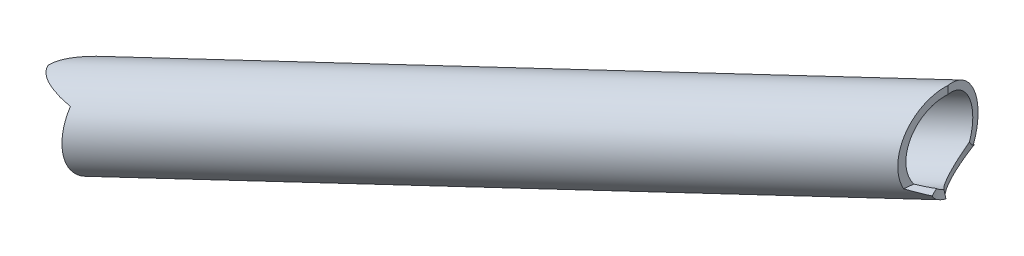
ISO-10303-21;
HEADER;
FILE_DESCRIPTION(('STEP AP214'),'2;1');
FILE_NAME('part.step','',(''),(''),'','','');
FILE_SCHEMA(('AUTOMOTIVE_DESIGN { 1 0 10303 214 1 1 1 1 }'));
ENDSEC;
DATA;
#1=APPLICATION_CONTEXT('core data for automotive mechanical design processes');
#2=APPLICATION_PROTOCOL_DEFINITION('international standard','automotive_design',2000,#1);
#3=PRODUCT_CONTEXT('',#1,'mechanical');
#4=PRODUCT('Part','Part','',(#3));
#5=PRODUCT_RELATED_PRODUCT_CATEGORY('part','',(#4));
#6=PRODUCT_DEFINITION_FORMATION('','',#4);
#7=PRODUCT_DEFINITION_CONTEXT('part definition',#1,'design');
#8=PRODUCT_DEFINITION('design','',#6,#7);
#9=PRODUCT_DEFINITION_SHAPE('','',#8);
#10=(LENGTH_UNIT() NAMED_UNIT(*) SI_UNIT(.MILLI.,.METRE.));
#11=(NAMED_UNIT(*) PLANE_ANGLE_UNIT() SI_UNIT($,.RADIAN.));
#12=(NAMED_UNIT(*) SI_UNIT($,.STERADIAN.) SOLID_ANGLE_UNIT());
#13=UNCERTAINTY_MEASURE_WITH_UNIT(LENGTH_MEASURE(1.E-05),#10,'distance_accuracy_value','');
#14=(GEOMETRIC_REPRESENTATION_CONTEXT(3) GLOBAL_UNCERTAINTY_ASSIGNED_CONTEXT((#13)) GLOBAL_UNIT_ASSIGNED_CONTEXT((#10,
#11,#12)) REPRESENTATION_CONTEXT('',''));
#15=CARTESIAN_POINT('',(0.,0.,0.));
#16=DIRECTION('',(0.,0.,1.));
#17=DIRECTION('',(1.,0.,0.));
#18=AXIS2_PLACEMENT_3D('',#15,#16,#17);
#19=CARTESIAN_POINT('',(325.,320.,-1580.));
#20=DIRECTION('',(-0.214351342090107,-0.914565726251124,-0.342962147344171));
#21=DIRECTION('',(0.,0.351123441588391,-0.936329177569045));
#22=AXIS2_PLACEMENT_3D('',#19,#20,#21);
#23=CYLINDRICAL_SURFACE('',#22,9.49999999999999);
#24=CARTESIAN_POINT('',(247.65625,-10.,-1703.75));
#25=DIRECTION('',(0.,1.,0.));
#26=DIRECTION('',(-0.52999894000318,0.,-0.847998304005088));
#27=AXIS2_PLACEMENT_3D('',#24,#25,#26);
#28=ELLIPSE('',#27,10.3874437094218,9.49999999999999);
#29=CARTESIAN_POINT('',(238.168722071905,-10.,-1706.90270720181));
#30=VERTEX_POINT('',#29);
#31=CARTESIAN_POINT('',(238.075805823074,-10.,-1706.46572045153));
#32=VERTEX_POINT('',#31);
#33=EDGE_CURVE('E221',#30,#32,#28,.T.);
#34=ORIENTED_EDGE('',*,*,#33,.T.);
#35=CARTESIAN_POINT('',(232.820393226593,-73.2996555665351,-1727.48737083745));
#36=DIRECTION('',(0.970142500145332,0.,-0.242535625036333));
#37=DIRECTION('',(-0.0940407512885346,-0.921768805422756,-0.376163005154139));
#38=AXIS2_PLACEMENT_3D('',#35,#36,#37);
#39=ELLIPSE('',#38,76.1396046117398,9.49999999999999);
#40=CARTESIAN_POINT('',(238.275469808564,-8.87542708308277,-1705.66706450957));
#41=VERTEX_POINT('',#40);
#42=EDGE_CURVE('E226',#32,#41,#39,.T.);
#43=ORIENTED_EDGE('',*,*,#42,.T.);
#44=CARTESIAN_POINT('',(239.782773736137,-12.8737095959373,-1698.60180246691));
#45=CARTESIAN_POINT('',(239.692006260419,-12.9119222917252,-1698.71566265582));
#46=CARTESIAN_POINT('',(239.602223253644,-12.9466216887689,-1698.83146667268));
#47=CARTESIAN_POINT('',(239.425209102269,-13.0081878544801,-1699.06699258332));
#48=CARTESIAN_POINT('',(239.337977700843,-13.0350554138938,-1699.18671408023));
#49=CARTESIAN_POINT('',(239.08093837754,-13.1026174647842,-1699.55197306294));
#50=CARTESIAN_POINT('',(238.915776519299,-13.1302751585701,-1699.80361594418));
#51=CARTESIAN_POINT('',(238.682099660331,-13.1398375519976,-1700.19240875895));
#52=CARTESIAN_POINT('',(238.60609363538,-13.137580055441,-1700.32481501614));
#53=CARTESIAN_POINT('',(238.460323287579,-13.1211715105605,-1700.59226680834));
#54=CARTESIAN_POINT('',(238.390555094563,-13.1070278942486,-1700.72731064264));
#55=CARTESIAN_POINT('',(238.258485514363,-13.0660797686918,-1700.99890931638));
#56=CARTESIAN_POINT('',(238.196173946375,-13.0392927749634,-1701.135461811));
#57=CARTESIAN_POINT('',(238.080031637345,-12.9725743749361,-1701.40897057867));
#58=CARTESIAN_POINT('',(238.02619930705,-12.93264543616,-1701.54592677113));
#59=CARTESIAN_POINT('',(237.933542688199,-12.844883986858,-1701.8032309462));
#60=CARTESIAN_POINT('',(237.89370827948,-12.7984640579542,-1701.92369867336));
#61=CARTESIAN_POINT('',(237.821906754938,-12.6955557383986,-1702.16265618788));
#62=CARTESIAN_POINT('',(237.789939045047,-12.6390681085843,-1702.28114612396));
#63=CARTESIAN_POINT('',(237.734095152224,-12.5165887774897,-1702.51511920128));
#64=CARTESIAN_POINT('',(237.71022103014,-12.450594661685,-1702.6306015698));
#65=CARTESIAN_POINT('',(237.670548242228,-12.3099678371142,-1702.85757880647));
#66=CARTESIAN_POINT('',(237.654749555807,-12.2353351503768,-1702.9690736848));
#67=CARTESIAN_POINT('',(237.621618092021,-12.0163070618853,-1703.27365117592));
#68=CARTESIAN_POINT('',(237.612926376163,-11.8633630581482,-1703.4616322651));
#69=CARTESIAN_POINT('',(237.618004985019,-11.5388112968538,-1703.81993854514));
#70=CARTESIAN_POINT('',(237.631782011028,-11.367197985431,-1703.99025845244));
#71=CARTESIAN_POINT('',(237.693541514667,-10.8937931199929,-1704.41843468173));
#72=CARTESIAN_POINT('',(237.757977807344,-10.580128088423,-1704.66089032158));
#73=CARTESIAN_POINT('',(237.882598976666,-10.0945787694214,-1704.9905553039));
#74=CARTESIAN_POINT('',(237.928903649803,-9.92992612682615,-1705.09492292919));
#75=CARTESIAN_POINT('',(238.029443499436,-9.59673517120306,-1705.29313719928));
#76=CARTESIAN_POINT('',(238.083677025867,-9.42819767278117,-1705.38698602599));
#77=CARTESIAN_POINT('',(238.23920489998,-8.96894622023937,-1705.62734758761));
#78=CARTESIAN_POINT('',(238.346809750414,-8.67551914735631,-1705.76458213841));
#79=CARTESIAN_POINT('',(238.576316905579,-8.08359432770293,-1706.01403159344));
#80=CARTESIAN_POINT('',(238.698230217718,-7.78509283017319,-1706.12622704016));
#81=CARTESIAN_POINT('',(238.953073817899,-7.18366679382568,-1706.32851937879));
#82=CARTESIAN_POINT('',(239.086051124451,-6.88072841160394,-1706.41851476285));
#83=CARTESIAN_POINT('',(239.359356137925,-6.27286550034176,-1706.57758422801));
#84=CARTESIAN_POINT('',(239.499681250519,-5.96794170515685,-1706.64666563566));
#85=CARTESIAN_POINT('',(239.738298454073,-5.4564395983941,-1706.74569845231));
#86=CARTESIAN_POINT('',(239.835334866963,-5.25029867522171,-1706.7810590934));
#87=CARTESIAN_POINT('',(240.030681699238,-4.83727550346377,-1706.84296973045));
#88=CARTESIAN_POINT('',(240.128992201631,-4.63039320721947,-1706.86951914932));
#89=CARTESIAN_POINT('',(240.326134963891,-4.21562136062818,-1706.91382084238));
#90=CARTESIAN_POINT('',(240.424967718676,-4.00773088098818,-1706.93156219595));
#91=CARTESIAN_POINT('',(240.622077257612,-3.59111949218371,-1706.95799731861));
#92=CARTESIAN_POINT('',(240.720354069815,-3.38239862584037,-1706.96669154832));
#93=CARTESIAN_POINT('',(240.914702087663,-2.96518032848685,-1706.97458639541));
#94=CARTESIAN_POINT('',(241.010782627164,-2.75668831635517,-1706.97384045504));
#95=CARTESIAN_POINT('',(241.20001643508,-2.3385898609877,-1706.96229158466));
#96=CARTESIAN_POINT('',(241.293169178516,-2.1289832256801,-1706.95148686155));
#97=CARTESIAN_POINT('',(241.474703593222,-1.70905091178722,-1706.91881531044));
#98=CARTESIAN_POINT('',(241.563094609628,-1.49872757228237,-1706.89697109364));
#99=CARTESIAN_POINT('',(241.733197598472,-1.07710307709451,-1706.84078849465));
#100=CARTESIAN_POINT('',(241.814913081132,-0.865802497851082,-1706.8064567313));
#101=CARTESIAN_POINT('',(241.946474201928,-0.504563580365376,-1706.73551066981));
#102=CARTESIAN_POINT('',(241.998647452456,-0.354766771140902,-1706.70250558407));
#103=CARTESIAN_POINT('',(242.097206992492,-0.0552247583612694,-1706.62841628796));
#104=CARTESIAN_POINT('',(242.143593102021,0.0945204434445587,-1706.58733182643));
#105=CARTESIAN_POINT('',(242.22921315779,0.392973033148623,-1706.49627378321));
#106=CARTESIAN_POINT('',(242.268463704466,0.541682035295554,-1706.44632138206));
#107=CARTESIAN_POINT('',(242.33863905596,0.837436727405299,-1706.33655191564));
#108=CARTESIAN_POINT('',(242.369565510991,0.984482741502426,-1706.27673680941));
#109=CARTESIAN_POINT('',(242.418033491382,1.25390089051002,-1706.15617731308));
#110=CARTESIAN_POINT('',(242.436881593928,1.37669025699559,-1706.0968940529));
#111=CARTESIAN_POINT('',(242.467186558548,1.61902522221298,-1705.97036182222));
#112=CARTESIAN_POINT('',(242.478645059312,1.73857153447599,-1705.90311462169));
#113=CARTESIAN_POINT('',(242.493969063744,1.97327707428727,-1705.76063196071));
#114=CARTESIAN_POINT('',(242.497836648068,2.0884374955121,-1705.68539869518));
#115=CARTESIAN_POINT('',(242.498171616062,2.31331195477555,-1705.52716836981));
#116=CARTESIAN_POINT('',(242.494638755539,2.42302581297066,-1705.44417105387));
#117=CARTESIAN_POINT('',(242.48076431483,2.63583554303248,-1705.27109449877));
#118=CARTESIAN_POINT('',(242.470438137981,2.73894580900772,-1705.18103168602));
#119=CARTESIAN_POINT('',(242.443872502729,2.93816128894712,-1704.9942973023));
#120=CARTESIAN_POINT('',(242.427632994945,3.03426644440424,-1704.89762567614));
#121=CARTESIAN_POINT('',(242.39027663956,3.21923212966204,-1704.69822204218));
#122=CARTESIAN_POINT('',(242.369152679131,3.30808183611597,-1704.59548136056));
#123=CARTESIAN_POINT('',(242.323163521343,3.47826478532818,-1704.38473007022));
#124=CARTESIAN_POINT('',(242.29829726785,3.55959589572854,-1704.27671797966));
#125=CARTESIAN_POINT('',(242.234364975778,3.7490199580815,-1704.0073383513));
#126=CARTESIAN_POINT('',(242.193875750635,3.85308064045996,-1703.84346310187));
#127=CARTESIAN_POINT('',(242.110385770336,4.04611107740568,-1703.50765098932));
#128=CARTESIAN_POINT('',(242.067383988415,4.13507460365672,-1703.3357108362));
#129=CARTESIAN_POINT('',(241.981323618566,4.2986023998736,-1702.98491003927));
#130=CARTESIAN_POINT('',(241.938265020182,4.37315072363439,-1702.80604199125));
#131=CARTESIAN_POINT('',(241.854192663671,4.50832720696617,-1702.44265131765));
#132=CARTESIAN_POINT('',(241.813179134929,4.56895380773782,-1702.25812806148));
#133=CARTESIAN_POINT('',(241.733861240021,4.67819595845542,-1701.87950569308));
#134=CARTESIAN_POINT('',(241.695656659189,4.72645316544172,-1701.68528237337));
#135=CARTESIAN_POINT('',(241.624698815335,4.80923265695602,-1701.29295268241));
#136=CARTESIAN_POINT('',(241.591945633143,4.8437547378362,-1701.09484625364));
#137=CARTESIAN_POINT('',(241.5331569735,4.89936037593066,-1700.6958405383));
#138=CARTESIAN_POINT('',(241.50711911976,4.92044869071724,-1700.49494226625));
#139=CARTESIAN_POINT('',(241.4627925276,4.94943649297081,-1700.09135070182));
#140=CARTESIAN_POINT('',(241.444503715785,4.9573361053566,-1699.88865742646));
#141=CARTESIAN_POINT('',(241.414832122645,4.96030467219689,-1699.45772183442));
#142=CARTESIAN_POINT('',(241.404567799309,4.9536858919862,-1699.22938724444));
#143=CARTESIAN_POINT('',(241.395872921846,4.92431934189652,-1698.77350822809));
#144=CARTESIAN_POINT('',(241.397443359448,4.90157022047179,-1698.54596386955));
#145=CARTESIAN_POINT('',(241.413134835549,4.84022675533106,-1698.09343611794));
#146=CARTESIAN_POINT('',(241.427256476798,4.80163165068857,-1697.86845284839));
#147=CARTESIAN_POINT('',(241.468502420081,4.70896136687954,-1697.42291431079));
#148=CARTESIAN_POINT('',(241.495625795675,4.65488729077963,-1697.2023587284));
#149=CARTESIAN_POINT('',(241.561355407631,4.53482429679474,-1696.77845491888));
#150=CARTESIAN_POINT('',(241.59931730576,4.46956921931241,-1696.57479853408));
#151=CARTESIAN_POINT('',(241.68704229901,4.32602795482659,-1696.1747494848));
#152=CARTESIAN_POINT('',(241.736805053388,4.24774214409611,-1695.97835661079));
#153=CARTESIAN_POINT('',(241.847808270866,4.07876379269744,-1695.59440359088));
#154=CARTESIAN_POINT('',(241.909046266285,3.98807392057893,-1695.40684155679));
#155=CARTESIAN_POINT('',(242.042475422824,3.79496851301777,-1695.04193172446));
#156=CARTESIAN_POINT('',(242.114666409571,3.69255316425159,-1694.86458376367));
#157=CARTESIAN_POINT('',(242.266409800551,3.4807401554084,-1694.52772299927));
#158=CARTESIAN_POINT('',(242.345592658823,3.37173914971898,-1694.36779370183));
#159=CARTESIAN_POINT('',(242.512607702723,3.14428091688507,-1694.05961583263));
#160=CARTESIAN_POINT('',(242.600439618028,3.02582398530337,-1693.91136689606));
#161=CARTESIAN_POINT('',(242.783772724404,2.78018696189209,-1693.6274278593));
#162=CARTESIAN_POINT('',(242.879272665142,2.65300829270191,-1693.49173571937));
#163=CARTESIAN_POINT('',(243.076860369986,2.39059573525173,-1693.23358578652));
#164=CARTESIAN_POINT('',(243.178948331819,2.25536160523034,-1693.11112839112));
#165=CARTESIAN_POINT('',(243.391584399356,1.97337318556635,-1692.87660667911));
#166=CARTESIAN_POINT('',(243.50229318868,1.82639680930093,-1692.76495517604));
#167=CARTESIAN_POINT('',(243.727936389725,1.52517450963389,-1692.55675528275));
#168=CARTESIAN_POINT('',(243.842870911117,1.37092839753044,-1692.46020728487));
#169=CARTESIAN_POINT('',(244.075519565355,1.05539763509681,-1692.28243710415));
#170=CARTESIAN_POINT('',(244.193237744637,0.894102407247794,-1692.20123899968));
#171=CARTESIAN_POINT('',(244.429441963521,0.565031102107958,-1692.05462789741));
#172=CARTESIAN_POINT('',(244.547928010171,0.397254965267959,-1691.9892150447));
#173=CARTESIAN_POINT('',(244.790734578104,0.0449848661019104,-1691.87088930994));
#174=CARTESIAN_POINT('',(244.914971453498,-0.139905167803635,-1691.81897914406));
#175=CARTESIAN_POINT('',(245.158978783918,-0.516817986689738,-1691.73335311035));
#176=CARTESIAN_POINT('',(245.278748017917,-0.708842693399959,-1691.69964218304));
#177=CARTESIAN_POINT('',(245.509845724332,-1.09962177152312,-1691.65063431907));
#178=CARTESIAN_POINT('',(245.621193041198,-1.29835958685332,-1691.6352950598));
#179=CARTESIAN_POINT('',(245.831194788942,-1.702944947269,-1691.62292924008));
#180=CARTESIAN_POINT('',(245.929858843463,-1.90878694968559,-1691.62588871043));
#181=CARTESIAN_POINT('',(246.075458046009,-2.24853501474536,-1691.64528320938));
#182=CARTESIAN_POINT('',(246.127902222336,-2.38041624710498,-1691.65623841123));
#183=CARTESIAN_POINT('',(246.224351904032,-2.64648771811791,-1691.68494523922));
#184=CARTESIAN_POINT('',(246.268360346212,-2.78067713540693,-1691.70269449361));
#185=CARTESIAN_POINT('',(246.346512687033,-3.05061670363609,-1691.74461841962));
#186=CARTESIAN_POINT('',(246.380677170663,-3.18636297131282,-1691.76877947692));
#187=CARTESIAN_POINT('',(246.438120935164,-3.45898015772126,-1691.82305316929));
#188=CARTESIAN_POINT('',(246.461400244357,-3.59585107352575,-1691.85316578887));
#189=CARTESIAN_POINT('',(246.49638036042,-3.8703202165227,-1691.91881461569));
#190=CARTESIAN_POINT('',(246.508038037876,-4.00791926172623,-1691.9543704648));
#191=CARTESIAN_POINT('',(246.519390999217,-4.28234076451446,-1692.0300531005));
#192=CARTESIAN_POINT('',(246.519086410004,-4.41916323032213,-1692.0701798386));
#193=CARTESIAN_POINT('',(246.506833479591,-4.6912674453412,-1692.15425822693));
#194=CARTESIAN_POINT('',(246.494870837663,-4.82654709579775,-1692.19821451449));
#195=CARTESIAN_POINT('',(246.46006971298,-5.09467447882347,-1692.28918274363));
#196=CARTESIAN_POINT('',(246.437227466839,-5.22752135334083,-1692.33619573771));
#197=CARTESIAN_POINT('',(246.370044302787,-5.54557589653684,-1692.45297000911));
#198=CARTESIAN_POINT('',(246.320700706941,-5.72927313697449,-1692.52397330357));
#199=CARTESIAN_POINT('',(246.205615074714,-6.08994182118237,-1692.66963824339));
#200=CARTESIAN_POINT('',(246.139864082192,-6.26690953057228,-1692.74430186883));
#201=CARTESIAN_POINT('',(245.994979126677,-6.61447708434479,-1692.89677665699));
#202=CARTESIAN_POINT('',(245.915808361948,-6.78505779894152,-1692.97459601492));
#203=CARTESIAN_POINT('',(245.746872271192,-7.11965443695521,-1693.13289694901));
#204=CARTESIAN_POINT('',(245.657102549833,-7.2836675988179,-1693.21337961961));
#205=CARTESIAN_POINT('',(245.467634342709,-7.60800436706373,-1693.37821132547));
#206=CARTESIAN_POINT('',(245.367800146872,-7.76822716723951,-1693.46260158804));
#207=CARTESIAN_POINT('',(245.161191688139,-8.0825723750402,-1693.63408807046));
#208=CARTESIAN_POINT('',(245.05441833204,-8.23669557553071,-1693.72118393597));
#209=CARTESIAN_POINT('',(244.83516083628,-8.53932670811306,-1693.89834228308));
#210=CARTESIAN_POINT('',(244.722671237416,-8.68782902666322,-1693.98840757062));
#211=CARTESIAN_POINT('',(244.493120349125,-8.97929974460534,-1694.17164889347));
#212=CARTESIAN_POINT('',(244.376058534414,-9.12226750437542,-1694.26482528602));
#213=CARTESIAN_POINT('',(244.137753591978,-9.40332410243954,-1694.45489354993));
#214=CARTESIAN_POINT('',(244.016496050789,-9.54139194548737,-1694.551798391));
#215=CARTESIAN_POINT('',(243.770916565681,-9.81209193504552,-1694.74925723976));
#216=CARTESIAN_POINT('',(243.64659437677,-9.94472364471123,-1694.84981153951));
#217=CARTESIAN_POINT('',(243.270080289072,-10.3342219093455,-1695.15724817698));
#218=CARTESIAN_POINT('',(243.014154914509,-10.5829087691985,-1695.37005017793));
#219=CARTESIAN_POINT('',(242.508459071945,-11.0455183381875,-1695.80350208304));
#220=CARTESIAN_POINT('',(242.258963195892,-11.2605246774581,-1696.02331533904));
#221=CARTESIAN_POINT('',(241.757317023848,-11.6662123190583,-1696.48229886428));
#222=CARTESIAN_POINT('',(241.505164913116,-11.8568756421995,-1696.72148322992));
#223=CARTESIAN_POINT('',(241.003867846224,-12.2073478270327,-1697.21996318928));
#224=CARTESIAN_POINT('',(240.754714683208,-12.3673829041764,-1697.47908979599));
#225=CARTESIAN_POINT('',(240.26241203291,-12.6507501161148,-1698.02171283521));
#226=CARTESIAN_POINT('',(240.019251756839,-12.7741534212817,-1698.30516061478));
#227=CARTESIAN_POINT('',(239.782773736137,-12.8737095959373,-1698.60180246691));
#228=B_SPLINE_CURVE_WITH_KNOTS('',3,(#44,#45,#46,#47,#48,#49,#50,#51,#52,#53,#54,#55,#56,#57,
#58,#59,#60,#61,#62,#63,#64,#65,#66,#67,#68,#69,#70,#71,#72,#73,#74,#75,#76,#77,#78,#79,#80,#81,
#82,#83,#84,#85,#86,#87,#88,#89,#90,#91,#92,#93,#94,#95,#96,#97,#98,#99,#100,#101,#102,#103,
#104,#105,#106,#107,#108,#109,#110,#111,#112,#113,#114,#115,#116,#117,#118,#119,#120,#121,#122,
#123,#124,#125,#126,#127,#128,#129,#130,#131,#132,#133,#134,#135,#136,#137,#138,#139,#140,#141,
#142,#143,#144,#145,#146,#147,#148,#149,#150,#151,#152,#153,#154,#155,#156,#157,#158,#159,#160,
#161,#162,#163,#164,#165,#166,#167,#168,#169,#170,#171,#172,#173,#174,#175,#176,#177,#178,#179,
#180,#181,#182,#183,#184,#185,#186,#187,#188,#189,#190,#191,#192,#193,#194,#195,#196,#197,#198,
#199,#200,#201,#202,#203,#204,#205,#206,#207,#208,#209,#210,#211,#212,#213,#214,#215,#216,#217,
#218,#219,#220,#221,#222,#223,#224,#225,#226,#227),.UNSPECIFIED.,.T.,.F.,(4,2,2,2,2,2,2,2,2,2,2,
2,2,2,2,2,2,2,2,2,2,2,2,2,2,2,2,2,2,2,2,2,2,2,2,2,2,2,2,2,2,2,2,2,2,2,2,2,2,2,2,2,2,2,2,2,2,2,2,
2,2,2,2,2,2,2,2,2,2,2,2,2,2,2,2,2,2,2,2,2,2,2,2,2,2,2,2,2,2,2,2,4),(0.,0.451505428161005,
0.902965254011547,1.80584158003309,2.26341651051946,2.72070554666514,3.17736292805024,
3.6339346166199,4.03865443390185,4.44334367860727,4.84813589097492,5.25292707113323,
5.97738288489809,6.70205480684309,7.89959359362267,8.50041944420078,9.10112043499262,
10.1235072216912,11.1466857439219,12.1744593764222,13.2018725428591,13.8934114338799,
14.5849956074548,15.2774351095314,15.9698393553243,16.6583255563386,17.3469345123909,
18.0341387354029,18.7209792454808,19.2067876962737,19.6926112517924,20.1772896873122,
20.6618719666359,21.074388258121,21.4868130400192,21.8991247611813,22.3114500876813,
22.7228437048278,23.1342407575613,23.5462407096009,23.9583571532375,24.5523715837487,
25.1466304816727,25.7415430390292,26.3365221756163,26.9471695177935,27.5578259135734,
28.1682659248008,28.7787001541201,29.4638065497709,30.1489703566106,30.8341670689677,
31.519314964803,32.1700903033499,32.8208468534891,33.4714636225832,34.1220700349165,
34.7486888814924,35.3752881495784,36.0017854524038,36.6283015672178,37.2732874294999,
37.9182900430258,38.5642961826847,39.2103082595189,39.8956266133297,40.5811309157304,
41.2650529727534,41.9484529900252,42.3751288374479,42.8016558713459,43.2272843992444,
43.6529118196777,44.0801129843529,44.5073096170402,44.9350309447882,45.3629003340731,
45.9709631957776,46.5793587034803,47.1894504689918,47.7997961310229,48.4198927004483,
49.039908399161,49.6605277895422,50.2812186912864,50.9043088258022,51.5274489337099,
52.7727681852627,53.9596595723089,55.1474225603143,56.326042303509,57.5023569376143),.UNSPECIFIED.);
#229=CARTESIAN_POINT('',(242.13529505725,-11.3593996180337,-1696.13718002754));
#230=VERTEX_POINT('',#229);
#231=EDGE_CURVE('E163',#230,#41,#228,.T.);
#232=ORIENTED_EDGE('',*,*,#231,.F.);
#233=CARTESIAN_POINT('',(250.,8.04911692853238E-13,-1700.));
#234=DIRECTION('',(-0.508456010272344,0.0599232902931692,-0.859000398660194));
#235=DIRECTION('',(0.0394871934442315,0.998148808069164,0.0462570913915509));
#236=AXIS2_PLACEMENT_3D('',#233,#234,#235);
#237=ELLIPSE('',#236,27.2370926599014,9.49999999999999);
#238=CARTESIAN_POINT('',(242.343886979706,-13.1916255339825,-1696.38846375506));
#239=VERTEX_POINT('',#238);
#240=EDGE_CURVE('E220',#239,#230,#237,.T.);
#241=ORIENTED_EDGE('',*,*,#240,.F.);
#242=CARTESIAN_POINT('',(250.,-1.45716771982052E-13,-1700.));
#243=DIRECTION('',(-0.71506324481371,0.5374052681337,0.447079560815114));
#244=DIRECTION('',(-0.649756055025887,-0.746861985871362,-0.141471703946349));
#245=AXIS2_PLACEMENT_3D('',#242,#243,#244);
#246=ELLIPSE('',#245,19.3266576466284,9.49999999999999);
#247=EDGE_CURVE('E160',#239,#30,#246,.F.);
#248=ORIENTED_EDGE('',*,*,#247,.T.);
#249=EDGE_LOOP('',(#34,#43,#232,#241,#248));
#250=FACE_BOUND('',#249,.T.);
#251=ADVANCED_FACE('F41',(#250),#23,.F.);
#252=CARTESIAN_POINT('',(250.,1.04083408558608E-13,-1700.));
#253=DIRECTION('',(-0.140336447675245,0.956366902675742,-0.256257739239816));
#254=DIRECTION('',(0.,0.258819045102518,0.965925826289069));
#255=AXIS2_PLACEMENT_3D('',#252,#253,#254);
#256=CYLINDRICAL_SURFACE('',#255,9.49999999999999);
#257=CARTESIAN_POINT('',(242.272833901891,-11.8252632103568,-1698.86391406331));
#258=CARTESIAN_POINT('',(242.306182685937,-11.8112190071964,-1699.07672724039));
#259=CARTESIAN_POINT('',(242.344163734431,-11.7862681084158,-1699.28819160604));
#260=CARTESIAN_POINT('',(242.428086033983,-11.716401595657,-1699.70629480317));
#261=CARTESIAN_POINT('',(242.474036024486,-11.6714639769248,-1699.91292805109));
#262=CARTESIAN_POINT('',(242.572775476666,-11.56341360665,-1700.32077743433));
#263=CARTESIAN_POINT('',(242.62559646598,-11.5002153239722,-1700.52196308752));
#264=CARTESIAN_POINT('',(242.736598432606,-11.3577725790933,-1700.91692726074));
#265=CARTESIAN_POINT('',(242.794778496478,-11.2785308487078,-1701.11070703514));
#266=CARTESIAN_POINT('',(242.932740113908,-11.0808833400592,-1701.5452899699));
#267=CARTESIAN_POINT('',(243.013908284643,-10.9577758236404,-1701.78351466194));
#268=CARTESIAN_POINT('',(243.180929224243,-10.6912881523033,-1702.24661461202));
#269=CARTESIAN_POINT('',(243.266783953051,-10.5478994751869,-1702.47148420153));
#270=CARTESIAN_POINT('',(243.441147137984,-10.2434569568088,-1702.908005322));
#271=CARTESIAN_POINT('',(243.529657229811,-10.082392057628,-1703.11964844731));
#272=CARTESIAN_POINT('',(243.707292910715,-9.7447534809875,-1703.52978496466));
#273=CARTESIAN_POINT('',(243.796418405179,-9.56818214067374,-1703.72828033045));
#274=CARTESIAN_POINT('',(243.976454907656,-9.1944176425431,-1704.11935459788));
#275=CARTESIAN_POINT('',(244.067315387578,-8.99671213871835,-1704.31146631569));
#276=CARTESIAN_POINT('',(244.245061627628,-8.58730248830898,-1704.68224037495));
#277=CARTESIAN_POINT('',(244.33194638761,-8.37559485169533,-1704.8608993394));
#278=CARTESIAN_POINT('',(244.49853261241,-7.93915886536552,-1705.20448961002));
#279=CARTESIAN_POINT('',(244.578244435606,-7.71445008735296,-1705.3694406844));
#280=CARTESIAN_POINT('',(244.726571976201,-7.25209474029863,-1705.68541487664));
#281=CARTESIAN_POINT('',(244.795193990076,-7.0144556159221,-1705.83644587684));
#282=CARTESIAN_POINT('',(244.923009083503,-6.49759413499834,-1706.14038118546));
#283=CARTESIAN_POINT('',(244.980165483789,-6.21675636129131,-1706.29144491629));
#284=CARTESIAN_POINT('',(245.063181563305,-5.63978168250809,-1706.57141116273));
#285=CARTESIAN_POINT('',(245.089087156897,-5.34366789043404,-1706.70034595099));
#286=CARTESIAN_POINT('',(245.095417382489,-4.78850218962999,-1706.91110440723));
#287=CARTESIAN_POINT('',(245.082549781039,-4.53124886388324,-1706.99717911366));
#288=CARTESIAN_POINT('',(245.034665561585,-4.14378890832791,-1707.10718731198));
#289=CARTESIAN_POINT('',(245.013956772192,-4.01443336443266,-1707.14066149467));
#290=CARTESIAN_POINT('',(244.962725164143,-3.75602692510059,-1707.2006810036));
#291=CARTESIAN_POINT('',(244.932202578726,-3.62697602249691,-1707.22722649449));
#292=CARTESIAN_POINT('',(244.86134866382,-3.36984217941504,-1707.27294741246));
#293=CARTESIAN_POINT('',(244.820988136862,-3.24176331259946,-1707.29210045451));
#294=CARTESIAN_POINT('',(244.731136754261,-2.98791064133933,-1707.32262939016));
#295=CARTESIAN_POINT('',(244.681645758387,-2.86213687233057,-1707.33400516429));
#296=CARTESIAN_POINT('',(244.574470718355,-2.61343047671428,-1707.34891913804));
#297=CARTESIAN_POINT('',(244.51677356448,-2.49050276943985,-1707.35244464342));
#298=CARTESIAN_POINT('',(244.394493475715,-2.24812995518145,-1707.35174422964));
#299=CARTESIAN_POINT('',(244.329908378486,-2.12868595691726,-1707.34751586952));
#300=CARTESIAN_POINT('',(244.171551500878,-1.85225755988898,-1707.32874622844));
#301=CARTESIAN_POINT('',(244.075486147902,-1.69679490225305,-1707.31110878131));
#302=CARTESIAN_POINT('',(243.876282694401,-1.39256390665326,-1707.26289426589));
#303=CARTESIAN_POINT('',(243.773141851049,-1.24379820221317,-1707.23231215556));
#304=CARTESIAN_POINT('',(243.562204013058,-0.952245231140034,-1707.1588934246));
#305=CARTESIAN_POINT('',(243.454397119498,-0.809472081523834,-1707.11602954586));
#306=CARTESIAN_POINT('',(243.236534046675,-0.529745846322635,-1707.01874232547));
#307=CARTESIAN_POINT('',(243.126477861794,-0.392792775277805,-1706.96431895495));
#308=CARTESIAN_POINT('',(242.869097963254,-0.0793656743045386,-1706.82443751376));
#309=CARTESIAN_POINT('',(242.721590426639,0.0950503419665062,-1706.73468307298));
#310=CARTESIAN_POINT('',(242.429239378744,0.435343321917623,-1706.53651196097));
#311=CARTESIAN_POINT('',(242.28439660557,0.601217941955566,-1706.42809020276));
#312=CARTESIAN_POINT('',(242.000309598649,0.924851263967931,-1706.19333080979));
#313=CARTESIAN_POINT('',(241.861064675791,1.0826109655836,-1706.06699538898));
#314=CARTESIAN_POINT('',(241.590728029943,1.39010807913711,-1705.79702891071));
#315=CARTESIAN_POINT('',(241.459635788292,1.53984600132281,-1705.65339895522));
#316=CARTESIAN_POINT('',(241.207602141981,1.8314610033306,-1705.34903997335));
#317=CARTESIAN_POINT('',(241.086690637135,1.97331453935937,-1705.188263523));
#318=CARTESIAN_POINT('',(240.857696348164,2.2481305175156,-1704.85071351418));
#319=CARTESIAN_POINT('',(240.749614054376,2.38109261972388,-1704.67393934473));
#320=CARTESIAN_POINT('',(240.548530500764,2.63716943946906,-1704.30558070524));
#321=CARTESIAN_POINT('',(240.455515288255,2.76029321349683,-1704.11401018284));
#322=CARTESIAN_POINT('',(240.286451187263,2.99579872815173,-1703.71725788103));
#323=CARTESIAN_POINT('',(240.210399671675,3.10818213055809,-1703.5120782156));
#324=CARTESIAN_POINT('',(240.083879977847,3.31011739771248,-1703.11156689992));
#325=CARTESIAN_POINT('',(240.031584121741,3.40082865347054,-1702.9173957758));
#326=CARTESIAN_POINT('',(239.943082121778,3.57187400403273,-1702.5209743837));
#327=CARTESIAN_POINT('',(239.906874921653,3.65220877983834,-1702.31872464706));
#328=CARTESIAN_POINT('',(239.851315548148,3.80166899053103,-1701.90800195331));
#329=CARTESIAN_POINT('',(239.83195328397,3.87080111603179,-1701.69953279941));
#330=CARTESIAN_POINT('',(239.810453628394,3.99722456419164,-1701.27816947174));
#331=CARTESIAN_POINT('',(239.80831473174,4.05451692117432,-1701.0652756863));
#332=CARTESIAN_POINT('',(239.820533865951,4.15084392101235,-1700.6617098871));
#333=CARTESIAN_POINT('',(239.83302329544,4.19122042753855,-1700.47129745821));
#334=CARTESIAN_POINT('',(239.871274938734,4.26202284098775,-1700.08995538718));
#335=CARTESIAN_POINT('',(239.897037105365,4.29244878327656,-1699.89902574688));
#336=CARTESIAN_POINT('',(239.961387476004,4.3431898248988,-1699.51801561684));
#337=CARTESIAN_POINT('',(239.99997445373,4.36350589045498,-1699.32793504768));
#338=CARTESIAN_POINT('',(240.089342192928,4.393976958013,-1698.94984039024));
#339=CARTESIAN_POINT('',(240.14012340737,4.40413158248349,-1698.76182637899));
#340=CARTESIAN_POINT('',(240.25345119488,4.4143357750619,-1698.3877987797));
#341=CARTESIAN_POINT('',(240.316070803858,4.41432042280272,-1698.20180562316));
#342=CARTESIAN_POINT('',(240.451956298069,4.40410381759778,-1697.83398394358));
#343=CARTESIAN_POINT('',(240.525225516876,4.39389936933576,-1697.6521567453));
#344=CARTESIAN_POINT('',(240.681381718443,4.36341080615504,-1697.29356013417));
#345=CARTESIAN_POINT('',(240.764268701408,4.34312669101981,-1697.11679072144));
#346=CARTESIAN_POINT('',(240.938589016362,4.29258488046559,-1696.7689788098));
#347=CARTESIAN_POINT('',(241.030023246487,4.26232613607676,-1696.59793691529));
#348=CARTESIAN_POINT('',(241.230928628879,4.18797767221872,-1696.24340050563));
#349=CARTESIAN_POINT('',(241.341274034783,4.14272159295027,-1696.06064537546));
#350=CARTESIAN_POINT('',(241.569488301715,4.03999103740575,-1695.70352892082));
#351=CARTESIAN_POINT('',(241.687355730878,3.98251888171454,-1695.52916600986));
#352=CARTESIAN_POINT('',(241.929070217446,3.85512265126011,-1695.18902634197));
#353=CARTESIAN_POINT('',(242.052924248721,3.78518378602449,-1695.023260089));
#354=CARTESIAN_POINT('',(242.304607531508,3.6325450017569,-1694.70089414032));
#355=CARTESIAN_POINT('',(242.432436399985,3.5498463093075,-1694.54429356553));
#356=CARTESIAN_POINT('',(242.679489265295,3.37833235070657,-1694.25289722378));
#357=CARTESIAN_POINT('',(242.798568095563,3.29056070716645,-1694.11736375719));
#358=CARTESIAN_POINT('',(243.036394630883,3.10299560714597,-1693.85449857295));
#359=CARTESIAN_POINT('',(243.155142294631,3.00320071410023,-1693.72716783816));
#360=CARTESIAN_POINT('',(243.389768830718,2.79085930700366,-1693.48124274748));
#361=CARTESIAN_POINT('',(243.505651895676,2.6783329612263,-1693.36263505172));
#362=CARTESIAN_POINT('',(243.731831670172,2.43939141782816,-1693.13443097743));
#363=CARTESIAN_POINT('',(243.842131002504,2.3129828310988,-1693.02483035274));
#364=CARTESIAN_POINT('',(244.020538653213,2.08721711178397,-1692.84807626047));
#365=CARTESIAN_POINT('',(244.091056448087,1.99175836061313,-1692.7783649402));
#366=CARTESIAN_POINT('',(244.226460672892,1.79369750142449,-1692.64381797528));
#367=CARTESIAN_POINT('',(244.29134894045,1.69109774427831,-1692.57898074054));
#368=CARTESIAN_POINT('',(244.414019452247,1.47899650710819,-1692.45463523114));
#369=CARTESIAN_POINT('',(244.471815823175,1.36950942708318,-1692.39511642893));
#370=CARTESIAN_POINT('',(244.579157269619,1.14380167072382,-1692.28162480737));
#371=CARTESIAN_POINT('',(244.62870256054,1.02758117028119,-1692.22765184325));
#372=CARTESIAN_POINT('',(244.718769626674,0.788366418832257,-1692.12526129457));
#373=CARTESIAN_POINT('',(244.75923323233,0.665334461612303,-1692.07688043428));
#374=CARTESIAN_POINT('',(244.830098917184,0.414208994414982,-1691.98629853367));
#375=CARTESIAN_POINT('',(244.860501204426,0.286115589157591,-1691.94409736557));
#376=CARTESIAN_POINT('',(244.911167331612,0.0259665619785593,-1691.86591304916));
#377=CARTESIAN_POINT('',(244.931421900408,-0.106092566796435,-1691.82993560655));
#378=CARTESIAN_POINT('',(244.962176838719,-0.372902091689947,-1691.76413902069));
#379=CARTESIAN_POINT('',(244.97267167168,-0.507653971148829,-1691.73432338041));
#380=CARTESIAN_POINT('',(244.986522227862,-0.820260993563903,-1691.67242767912));
#381=CARTESIAN_POINT('',(244.986705532772,-0.99867312569114,-1691.6424526022));
#382=CARTESIAN_POINT('',(244.974021558085,-1.35639289342511,-1691.59200210928));
#383=CARTESIAN_POINT('',(244.961146159486,-1.5357010170859,-1691.57153261475));
#384=CARTESIAN_POINT('',(244.924650915598,-1.89454159095661,-1691.53936372928));
#385=CARTESIAN_POINT('',(244.900997183435,-2.07407295416373,-1691.52769230885));
#386=CARTESIAN_POINT('',(244.845083700087,-2.43206580858354,-1691.51262665783));
#387=CARTESIAN_POINT('',(244.812824997574,-2.61052742745612,-1691.50923141915));
#388=CARTESIAN_POINT('',(244.714274464638,-3.10212346477933,-1691.51061769693));
#389=CARTESIAN_POINT('',(244.640828887169,-3.41381531691032,-1691.52364402371));
#390=CARTESIAN_POINT('',(244.480540888718,-4.03199550332753,-1691.57248304004));
#391=CARTESIAN_POINT('',(244.393688114867,-4.33847961150002,-1691.60831340594));
#392=CARTESIAN_POINT('',(244.211881251368,-4.94580173960776,-1691.70245977507));
#393=CARTESIAN_POINT('',(244.116920513401,-5.24663487448058,-1691.76079437178));
#394=CARTESIAN_POINT('',(243.923025058425,-5.84149487657157,-1691.90038741409));
#395=CARTESIAN_POINT('',(243.824092115233,-6.13552469139931,-1691.98163572294));
#396=CARTESIAN_POINT('',(243.64109299854,-6.67006063837838,-1692.15352415812));
#397=CARTESIAN_POINT('',(243.557131653367,-6.91172169788706,-1692.24068640502));
#398=CARTESIAN_POINT('',(243.39046247159,-7.388277355806,-1692.43306021435));
#399=CARTESIAN_POINT('',(243.3077547864,-7.62317113992194,-1692.53827393836));
#400=CARTESIAN_POINT('',(243.145579133717,-8.08402346594844,-1692.76762797379));
#401=CARTESIAN_POINT('',(243.066104009273,-8.31000170948471,-1692.89172322418));
#402=CARTESIAN_POINT('',(242.912130871465,-8.75124402633492,-1693.16011565665));
#403=CARTESIAN_POINT('',(242.83763058764,-8.96651297565368,-1693.30440352866));
#404=CARTESIAN_POINT('',(242.669826223141,-9.45942684370936,-1693.6708488128));
#405=CARTESIAN_POINT('',(242.579486139519,-9.73142045753405,-1693.90228075993));
#406=CARTESIAN_POINT('',(242.458334353766,-10.1129728978526,-1694.28025975311));
#407=CARTESIAN_POINT('',(242.420345603693,-10.2357431698421,-1694.41138117166));
#408=CARTESIAN_POINT('',(242.349934835676,-10.4710476691578,-1694.68385734368));
#409=CARTESIAN_POINT('',(242.317509503766,-10.5835879712603,-1694.82520593328));
#410=CARTESIAN_POINT('',(242.263643686624,-10.7799961507102,-1695.09463612978));
#411=CARTESIAN_POINT('',(242.241276969743,-10.8655839514453,-1695.22128136403));
#412=CARTESIAN_POINT('',(242.201502606783,-11.0274049990306,-1695.48109795078));
#413=CARTESIAN_POINT('',(242.184092610641,-11.1036426691401,-1695.61426617539));
#414=CARTESIAN_POINT('',(242.15460902574,-11.2458854323348,-1695.8865497673));
#415=CARTESIAN_POINT('',(242.142535743524,-11.3118899374821,-1696.02566547572));
#416=CARTESIAN_POINT('',(242.124024850364,-11.4328511617232,-1696.30898938948));
#417=CARTESIAN_POINT('',(242.11758711518,-11.4878081243492,-1696.45319748249));
#418=CARTESIAN_POINT('',(242.110510612547,-11.5862204034553,-1696.74619535636));
#419=CARTESIAN_POINT('',(242.109892344649,-11.6296345381113,-1696.89499948251));
#420=CARTESIAN_POINT('',(242.114543018528,-11.7043161693384,-1697.19555485482));
#421=CARTESIAN_POINT('',(242.119812702572,-11.7355821337741,-1697.3473064702));
#422=CARTESIAN_POINT('',(242.13611522061,-11.7858066826724,-1697.65232205361));
#423=CARTESIAN_POINT('',(242.147140942948,-11.8047803896906,-1697.80558392696));
#424=CARTESIAN_POINT('',(242.174699318767,-11.8306203602947,-1698.11256460075));
#425=CARTESIAN_POINT('',(242.191229339449,-11.8374924024513,-1698.26628314799));
#426=CARTESIAN_POINT('',(242.219576479015,-11.8390041327376,-1698.49395536634));
#427=CARTESIAN_POINT('',(242.229426999632,-11.8381248425851,-1698.56815686799));
#428=CARTESIAN_POINT('',(242.25027809738,-11.8336867672895,-1698.71626414294));
#429=CARTESIAN_POINT('',(242.261277887802,-11.8301298048734,-1698.79017008305));
#430=CARTESIAN_POINT('',(242.272833901891,-11.8252632103568,-1698.86391406331));
#431=B_SPLINE_CURVE_WITH_KNOTS('',3,(#257,#258,#259,#260,#261,#262,#263,#264,#265,#266,#267,
#268,#269,#270,#271,#272,#273,#274,#275,#276,#277,#278,#279,#280,#281,#282,#283,#284,#285,#286,
#287,#288,#289,#290,#291,#292,#293,#294,#295,#296,#297,#298,#299,#300,#301,#302,#303,#304,#305,
#306,#307,#308,#309,#310,#311,#312,#313,#314,#315,#316,#317,#318,#319,#320,#321,#322,#323,#324,
#325,#326,#327,#328,#329,#330,#331,#332,#333,#334,#335,#336,#337,#338,#339,#340,#341,#342,#343,
#344,#345,#346,#347,#348,#349,#350,#351,#352,#353,#354,#355,#356,#357,#358,#359,#360,#361,#362,
#363,#364,#365,#366,#367,#368,#369,#370,#371,#372,#373,#374,#375,#376,#377,#378,#379,#380,#381,
#382,#383,#384,#385,#386,#387,#388,#389,#390,#391,#392,#393,#394,#395,#396,#397,#398,#399,#400,
#401,#402,#403,#404,#405,#406,#407,#408,#409,#410,#411,#412,#413,#414,#415,#416,#417,#418,#419,
#420,#421,#422,#423,#424,#425,#426,#427,#428,#429,#430),.UNSPECIFIED.,.T.,.F.,(4,2,2,2,2,2,2,2,
2,2,2,2,2,2,2,2,2,2,2,2,2,2,2,2,2,2,2,2,2,2,2,2,2,2,2,2,2,2,2,2,2,2,2,2,2,2,2,2,2,2,2,2,2,2,2,2,
2,2,2,2,2,2,2,2,2,2,2,2,2,2,2,2,2,2,2,2,2,2,2,2,2,2,2,2,2,2,4),(0.,0.647496658929199,
1.29570796291278,1.94700605596812,2.59819334166332,3.43740874357299,4.27697783951407,
5.11707518101082,5.95704611881677,6.8271286759491,7.69742892429349,8.56645150414118,
9.43497893104351,10.404923809603,11.3734418817063,12.1845449332511,12.5897161825737,
12.9948778030794,13.401256842126,13.8076421231216,14.2146840719646,14.6218541822156,
15.1717896413469,15.721939502141,16.2733199490354,16.8247017733501,17.5600335132628,
18.2955659546017,19.0310075708625,19.7664023516106,20.5038866053125,21.2413990369104,
21.9782245507951,22.7149358758539,23.3758086581847,24.0366380458126,24.6970712967796,
25.3574468278063,25.9418898336888,26.5263307623497,27.1107158239957,27.6951225966854,
28.2832599841564,28.8715818703672,29.4599037692159,30.0482875579738,30.7023085720976,
31.3562054582282,32.0108833529346,32.665498353625,33.2669021078675,33.8683777906036,
34.4689136571908,35.0691647713581,35.4817522657949,35.8942045700521,36.3058214731177,
36.7174276286908,37.1315993738533,37.5457625543979,37.9603034353987,38.3750793361787,
38.9169343232499,39.4591264050225,40.0030350167223,40.5468773735406,41.5068654476568,
42.4675985553168,43.4291271469888,44.3902310353991,45.2004230408652,46.0107121315474,
46.8190969386261,47.6271102500531,48.7278118651265,49.2780868863544,49.828032978115,
50.2910187984396,50.7537847425944,51.2165772647435,51.6793595839761,52.1437714844093,
52.6082419377814,53.0721398855775,53.5358162609971,53.7603393737135,53.9847097886052),.UNSPECIFIED.);
#432=CARTESIAN_POINT('',(242.494210145051,-10.,-1694.16838502064));
#433=VERTEX_POINT('',#432);
#434=EDGE_CURVE('E169',#433,#230,#431,.T.);
#435=ORIENTED_EDGE('',*,*,#434,.F.);
#436=CARTESIAN_POINT('',(251.467391304348,-10.,-1697.32050807569));
#437=DIRECTION('',(0.,1.,0.));
#438=DIRECTION('',(-0.480327336741099,0.,-0.877089305361321));
#439=AXIS2_PLACEMENT_3D('',#436,#437,#438);
#440=ELLIPSE('',#439,9.93342614996473,9.49999999999999);
#441=CARTESIAN_POINT('',(243.437962250655,-10.,-1692.24026153614));
#442=VERTEX_POINT('',#441);
#443=EDGE_CURVE('E123',#433,#442,#440,.T.);
#444=ORIENTED_EDGE('',*,*,#443,.T.);
#445=CARTESIAN_POINT('',(250.,-1.87350135405495E-13,-1700.));
#446=DIRECTION('',(-0.872585214874351,0.470357898518335,-0.131751622700061));
#447=DIRECTION('',(-0.488413504418264,-0.843958437392222,0.221780081739432));
#448=AXIS2_PLACEMENT_3D('',#445,#446,#447);
#449=ELLIPSE('',#448,15.6752068398415,9.49999999999999);
#450=EDGE_CURVE('E216',#442,#239,#449,.F.);
#451=ORIENTED_EDGE('',*,*,#450,.T.);
#452=ORIENTED_EDGE('',*,*,#240,.T.);
#453=EDGE_LOOP('',(#435,#444,#451,#452));
#454=FACE_BOUND('',#453,.T.);
#455=ADVANCED_FACE('F178',(#454),#256,.F.);
#456=CARTESIAN_POINT('',(250.,-2.22044604925031E-13,-1700.));
#457=DIRECTION('',(-0.917328644212008,-0.386243639668214,0.0965609099170536));
#458=DIRECTION('',(0.388057000058133,-0.921635375138065,0.));
#459=AXIS2_PLACEMENT_3D('',#456,#457,#458);
#460=CYLINDRICAL_SURFACE('',#459,9.49999999999999);
#461=CARTESIAN_POINT('',(226.250000000001,-10.,-1697.5));
#462=DIRECTION('',(0.,1.,0.));
#463=DIRECTION('',(-0.994505452921406,0.,0.104684784518043));
#464=AXIS2_PLACEMENT_3D('',#461,#462,#463);
#465=ELLIPSE('',#464,24.5958742729344,9.49999999999999);
#466=CARTESIAN_POINT('',(238.842425919066,-10.,-1690.44080156087));
#467=VERTEX_POINT('',#466);
#468=EDGE_CURVE('E128',#467,#442,#465,.T.);
#469=ORIENTED_EDGE('',*,*,#468,.F.);
#470=CARTESIAN_POINT('',(239.812347515301,-4.28953788829457,-1698.92761552793));
#471=DIRECTION('',(0.993532672656404,0.,0.113546591160732));
#472=DIRECTION('',(-0.0522307164495709,-0.887922179642703,0.457018768933745));
#473=AXIS2_PLACEMENT_3D('',#470,#471,#472);
#474=ELLIPSE('',#473,10.5504934589476,9.49999999999999);
#475=CARTESIAN_POINT('',(239.858774037238,6.03776419494777,-1699.33384759487));
#476=VERTEX_POINT('',#475);
#477=EDGE_CURVE('E136',#476,#467,#474,.T.);
#478=ORIENTED_EDGE('',*,*,#477,.F.);
#479=CARTESIAN_POINT('',(239.956537578624,-4.22882628268496,-1698.94279342933));
#480=DIRECTION('',(0.970142500145332,0.,-0.242535625036333));
#481=DIRECTION('',(-0.0767282113106876,-0.948639703477596,-0.306912845242752));
#482=AXIS2_PLACEMENT_3D('',#479,#480,#481);
#483=ELLIPSE('',#482,10.4011679570996,9.49999999999999);
#484=CARTESIAN_POINT('',(237.960015298346,-10.,-1706.92888255044));
#485=VERTEX_POINT('',#484);
#486=EDGE_CURVE('E144',#485,#476,#483,.T.);
#487=ORIENTED_EDGE('',*,*,#486,.F.);
#488=EDGE_CURVE('E213',#30,#485,#465,.T.);
#489=ORIENTED_EDGE('',*,*,#488,.F.);
#490=ORIENTED_EDGE('',*,*,#247,.F.);
#491=ORIENTED_EDGE('',*,*,#450,.F.);
#492=EDGE_LOOP('',(#469,#478,#487,#489,#490,#491));
#493=FACE_BOUND('',#492,.T.);
#494=CARTESIAN_POINT('',(88.8957487218309,-67.8333689592293,-1683.04165776019));
#495=DIRECTION('',(0.0393485848218571,-0.972627071428273,-0.229015870186713));
#496=DIRECTION('',(-0.980542619194856,-0.0816981850649064,0.178498119036565));
#497=AXIS2_PLACEMENT_3D('',#494,#495,#496);
#498=ELLIPSE('',#497,29.9248927403965,9.49999999999999);
#499=CARTESIAN_POINT('',(59.5554108690364,-69.9999999999998,-1678.88114595561));
#500=VERTEX_POINT('',#499);
#501=CARTESIAN_POINT('',(74.2128921385552,-67.0692924253525,-1688.80942899853));
#502=VERTEX_POINT('',#501);
#503=EDGE_CURVE('E11',#500,#502,#498,.T.);
#504=ORIENTED_EDGE('',*,*,#503,.F.);
#505=CARTESIAN_POINT('',(83.7500000000009,-69.9999999999998,-1682.5));
#506=DIRECTION('',(0.,-1.,0.));
#507=DIRECTION('',(-0.994505452921406,0.,0.104684784518043));
#508=AXIS2_PLACEMENT_3D('',#505,#506,#507);
#509=ELLIPSE('',#508,24.5958742729344,9.49999999999999);
#510=CARTESIAN_POINT('',(70.,-69.9999999999998,-1673.37369865446));
#511=VERTEX_POINT('',#510);
#512=EDGE_CURVE('E197',#511,#500,#509,.T.);
#513=ORIENTED_EDGE('',*,*,#512,.F.);
#514=CARTESIAN_POINT('',(70.0000000000001,-75.7894736842107,-1681.05263157895));
#515=DIRECTION('',(-1.,0.,0.));
#516=DIRECTION('',(0.,-0.970142500145332,0.242535625036333));
#517=AXIS2_PLACEMENT_3D('',#514,#515,#516);
#518=ELLIPSE('',#517,10.356157588604,9.49999999999999);
#519=CARTESIAN_POINT('',(70.0000000000001,-85.9364534176571,-1678.99138984272));
#520=VERTEX_POINT('',#519);
#521=EDGE_CURVE('E230',#520,#511,#518,.T.);
#522=ORIENTED_EDGE('',*,*,#521,.F.);
#523=CARTESIAN_POINT('',(71.2080625089739,-75.2808157856954,-1681.17979605358));
#524=DIRECTION('',(-0.94343640931858,0.0393485848218572,-0.329210313393401));
#525=DIRECTION('',(-0.252656200168243,-0.728279271838357,0.637004039804409));
#526=AXIS2_PLACEMENT_3D('',#523,#524,#525);
#527=ELLIPSE('',#526,11.6072461605859,9.49999999999999);
#528=EDGE_CURVE('E50',#502,#520,#527,.T.);
#529=ORIENTED_EDGE('',*,*,#528,.F.);
#530=EDGE_LOOP('',(#504,#513,#522,#529));
#531=FACE_BOUND('',#530,.T.);
#532=ADVANCED_FACE('F184',(#493,#531),#460,.T.);
#533=CARTESIAN_POINT('',(250.,-2.22044604925031E-13,-1700.));
#534=DIRECTION('',(-0.917328644212008,-0.386243639668214,0.0965609099170536));
#535=DIRECTION('',(0.388057000058133,-0.921635375138065,0.));
#536=AXIS2_PLACEMENT_3D('',#533,#534,#535);
#537=CYLINDRICAL_SURFACE('',#536,7.90000000000002);
#538=ORIENTED_EDGE('',*,*,#231,.T.);
#539=CARTESIAN_POINT('',(239.956537578624,-4.22882628268496,-1698.94279342933));
#540=DIRECTION('',(0.970142500145332,0.,-0.242535625036333));
#541=DIRECTION('',(-0.0767282113106876,-0.948639703477596,-0.306912845242752));
#542=AXIS2_PLACEMENT_3D('',#539,#540,#541);
#543=ELLIPSE('',#542,8.64939230116703,7.90000000000002);
#544=CARTESIAN_POINT('',(239.858774037238,4.30130874826848,-1699.33384759487));
#545=VERTEX_POINT('',#544);
#546=EDGE_CURVE('E127',#41,#545,#543,.T.);
#547=ORIENTED_EDGE('',*,*,#546,.T.);
#548=CARTESIAN_POINT('',(239.812347515301,-4.28953788829457,-1698.92761552793));
#549=DIRECTION('',(0.993532672656404,0.,0.113546591160732));
#550=DIRECTION('',(-0.0522307164495709,-0.887922179642703,0.457018768933745));
#551=AXIS2_PLACEMENT_3D('',#548,#549,#550);
#552=ELLIPSE('',#551,8.77356824480906,7.90000000000002);
#553=CARTESIAN_POINT('',(239.075819528431,-10.,-1692.48299564282));
#554=VERTEX_POINT('',#553);
#555=EDGE_CURVE('E133',#545,#554,#552,.T.);
#556=ORIENTED_EDGE('',*,*,#555,.T.);
#557=CARTESIAN_POINT('',(226.250000000001,-10.,-1697.5));
#558=DIRECTION('',(0.,1.,0.));
#559=DIRECTION('',(-0.994505452921406,0.,0.104684784518043));
#560=AXIS2_PLACEMENT_3D('',#557,#558,#559);
#561=ELLIPSE('',#560,20.4534112374929,7.90000000000002);
#562=EDGE_CURVE('E117',#554,#433,#561,.T.);
#563=ORIENTED_EDGE('',*,*,#562,.T.);
#564=ORIENTED_EDGE('',*,*,#434,.T.);
#565=EDGE_LOOP('',(#538,#547,#556,#563,#564));
#566=FACE_BOUND('',#565,.T.);
#567=CARTESIAN_POINT('',(83.7500000000009,-69.9999999999998,-1682.5));
#568=DIRECTION('',(0.,-1.,0.));
#569=DIRECTION('',(-0.994505452921406,0.,0.104684784518043));
#570=AXIS2_PLACEMENT_3D('',#567,#568,#569);
#571=ELLIPSE('',#570,20.4534112374929,7.90000000000002);
#572=CARTESIAN_POINT('',(70.,-69.9999999999998,-1675.41748294643));
#573=VERTEX_POINT('',#572);
#574=CARTESIAN_POINT('',(64.7006707139186,-69.9999999999998,-1677.99710812334));
#575=VERTEX_POINT('',#574);
#576=EDGE_CURVE('E147',#573,#575,#571,.T.);
#577=ORIENTED_EDGE('',*,*,#576,.T.);
#578=CARTESIAN_POINT('',(88.8957487218309,-67.8333689592293,-1683.04165776019));
#579=DIRECTION('',(0.0393485848218571,-0.972627071428273,-0.229015870186713));
#580=DIRECTION('',(-0.980542619194856,-0.0816981850649064,0.178498119036565));
#581=AXIS2_PLACEMENT_3D('',#578,#579,#580);
#582=ELLIPSE('',#581,24.8849108051719,7.90000000000002);
#583=CARTESIAN_POINT('',(73.4133244191094,-67.6255134475756,-1686.58454490964));
#584=VERTEX_POINT('',#583);
#585=EDGE_CURVE('E157',#575,#584,#582,.T.);
#586=ORIENTED_EDGE('',*,*,#585,.T.);
#587=CARTESIAN_POINT('',(71.2080625089739,-75.2808157856954,-1681.17979605358));
#588=DIRECTION('',(-0.94343640931858,0.0393485848218572,-0.329210313393401));
#589=DIRECTION('',(-0.252656200168243,-0.728279271838357,0.637004039804409));
#590=AXIS2_PLACEMENT_3D('',#587,#588,#589);
#591=ELLIPSE('',#590,9.65234154406622,7.90000000000002);
#592=CARTESIAN_POINT('',(70.0000000000001,-84.0932648775797,-1678.77108428831));
#593=VERTEX_POINT('',#592);
#594=EDGE_CURVE('E154',#584,#593,#591,.T.);
#595=ORIENTED_EDGE('',*,*,#594,.T.);
#596=CARTESIAN_POINT('',(70.0000000000001,-75.7894736842107,-1681.05263157895));
#597=DIRECTION('',(-1.,0.,0.));
#598=DIRECTION('',(0.,-0.970142500145332,0.242535625036333));
#599=AXIS2_PLACEMENT_3D('',#596,#597,#598);
#600=ELLIPSE('',#599,8.61196262631281,7.90000000000002);
#601=EDGE_CURVE('E143',#593,#573,#600,.T.);
#602=ORIENTED_EDGE('',*,*,#601,.T.);
#603=EDGE_LOOP('',(#577,#586,#595,#602));
#604=FACE_BOUND('',#603,.T.);
#605=ADVANCED_FACE('F43',(#566,#604),#537,.F.);
#606=CARTESIAN_POINT('',(259.935326726564,-10.,-1698.86453408839));
#607=DIRECTION('',(0.,1.,0.));
#608=DIRECTION('',(0.,0.,1.));
#609=AXIS2_PLACEMENT_3D('',#606,#607,#608);
#610=PLANE('',#609);
#611=DIRECTION('',(-0.113546591160732,0.,0.993532672656405));
#612=VECTOR('',#611,1.);
#613=CARTESIAN_POINT('',(240.064673273436,-10.,-1701.13546591161));
#614=LINE('',#613,#612);
#615=EDGE_CURVE('E120',#554,#467,#614,.T.);
#616=ORIENTED_EDGE('',*,*,#615,.T.);
#617=ORIENTED_EDGE('',*,*,#468,.T.);
#618=ORIENTED_EDGE('',*,*,#443,.F.);
#619=ORIENTED_EDGE('',*,*,#562,.F.);
#620=EDGE_LOOP('',(#616,#617,#618,#619));
#621=FACE_BOUND('',#620,.T.);
#622=ADVANCED_FACE('F119',(#621),#610,.T.);
#623=ORIENTED_EDGE('',*,*,#488,.T.);
#624=DIRECTION('',(0.242535625036333,0.,0.970142500145332));
#625=VECTOR('',#624,1.);
#626=CARTESIAN_POINT('',(165.298574998547,-10.,-1997.57464374964));
#627=LINE('',#626,#625);
#628=EDGE_CURVE('E322',#485,#32,#627,.T.);
#629=ORIENTED_EDGE('',*,*,#628,.T.);
#630=ORIENTED_EDGE('',*,*,#33,.F.);
#631=EDGE_LOOP('',(#623,#629,#630));
#632=FACE_BOUND('',#631,.T.);
#633=ADVANCED_FACE('F244',(#632),#610,.T.);
#634=CARTESIAN_POINT('',(165.298574998547,10.,-1997.57464374964));
#635=DIRECTION('',(0.970142500145332,0.,-0.242535625036333));
#636=DIRECTION('',(-0.242535625036333,0.,-0.970142500145332));
#637=AXIS2_PLACEMENT_3D('',#634,#635,#636);
#638=PLANE('',#637);
#639=ORIENTED_EDGE('',*,*,#486,.T.);
#640=DIRECTION('',(0.,1.,0.));
#641=VECTOR('',#640,1.);
#642=CARTESIAN_POINT('',(239.858774037238,10.,-1699.33384759487));
#643=LINE('',#642,#641);
#644=EDGE_CURVE('E138',#545,#476,#643,.T.);
#645=ORIENTED_EDGE('',*,*,#644,.F.);
#646=ORIENTED_EDGE('',*,*,#546,.F.);
#647=ORIENTED_EDGE('',*,*,#42,.F.);
#648=ORIENTED_EDGE('',*,*,#628,.F.);
#649=EDGE_LOOP('',(#639,#645,#646,#647,#648));
#650=FACE_BOUND('',#649,.T.);
#651=ADVANCED_FACE('F239',(#650),#638,.T.);
#652=CARTESIAN_POINT('',(240.064673273436,10.,-1701.13546591161));
#653=DIRECTION('',(0.993532672656404,0.,0.113546591160732));
#654=DIRECTION('',(0.113546591160732,0.,-0.993532672656404));
#655=AXIS2_PLACEMENT_3D('',#652,#653,#654);
#656=PLANE('',#655);
#657=ORIENTED_EDGE('',*,*,#644,.T.);
#658=ORIENTED_EDGE('',*,*,#477,.T.);
#659=ORIENTED_EDGE('',*,*,#615,.F.);
#660=ORIENTED_EDGE('',*,*,#555,.F.);
#661=EDGE_LOOP('',(#657,#658,#659,#660));
#662=FACE_BOUND('',#661,.T.);
#663=ADVANCED_FACE('F132',(#662),#656,.T.);
#664=CARTESIAN_POINT('',(70.0000000000001,-89.9999999999998,-1085.));
#665=DIRECTION('',(-1.,0.,0.));
#666=DIRECTION('',(0.,0.,1.));
#667=AXIS2_PLACEMENT_3D('',#664,#665,#666);
#668=PLANE('',#667);
#669=DIRECTION('',(0.,-0.992932622114171,-0.118679433523578));
#670=VECTOR('',#669,1.);
#671=CARTESIAN_POINT('',(70.0000000000001,-19.9464157685872,-1671.10398629492));
#672=LINE('',#671,#670);
#673=EDGE_CURVE('E62',#593,#520,#672,.T.);
#674=ORIENTED_EDGE('',*,*,#673,.T.);
#675=ORIENTED_EDGE('',*,*,#521,.T.);
#676=DIRECTION('',(0.,0.,-1.));
#677=VECTOR('',#676,1.);
#678=CARTESIAN_POINT('',(70.0000000000001,-69.9999999999998,-1085.));
#679=LINE('',#678,#677);
#680=EDGE_CURVE('E57',#511,#573,#679,.T.);
#681=ORIENTED_EDGE('',*,*,#680,.T.);
#682=ORIENTED_EDGE('',*,*,#601,.F.);
#683=EDGE_LOOP('',(#674,#675,#681,#682));
#684=FACE_BOUND('',#683,.T.);
#685=ADVANCED_FACE('F180',(#684),#668,.T.);
#686=CARTESIAN_POINT('',(70.0000000000001,-69.9999999999998,-1085.));
#687=DIRECTION('',(0.,-1.,0.));
#688=DIRECTION('',(0.,0.,-1.));
#689=AXIS2_PLACEMENT_3D('',#686,#687,#688);
#690=PLANE('',#689);
#691=ORIENTED_EDGE('',*,*,#680,.F.);
#692=ORIENTED_EDGE('',*,*,#512,.T.);
#693=DIRECTION('',(0.985558600813723,0.,0.169334711037329));
#694=VECTOR('',#693,1.);
#695=CARTESIAN_POINT('',(168.812906675213,-69.9999999999999,-1660.1089628853));
#696=LINE('',#695,#694);
#697=EDGE_CURVE('E204',#500,#575,#696,.T.);
#698=ORIENTED_EDGE('',*,*,#697,.T.);
#699=ORIENTED_EDGE('',*,*,#576,.F.);
#700=EDGE_LOOP('',(#691,#692,#698,#699));
#701=FACE_BOUND('',#700,.T.);
#702=ADVANCED_FACE('F233',(#701),#690,.T.);
#703=CARTESIAN_POINT('',(69.8278499414045,-90.1197565625008,-1678.99805556793));
#704=DIRECTION('',(-0.94343640931858,0.0393485848218572,-0.329210313393401));
#705=DIRECTION('',(-0.329465469723453,0.,0.944167625085665));
#706=AXIS2_PLACEMENT_3D('',#703,#704,#705);
#707=PLANE('',#706);
#708=DIRECTION('',(0.3292103133934,0.229015870186713,-0.916063480746854));
#709=VECTOR('',#708,1.);
#710=CARTESIAN_POINT('',(69.0408782449674,-70.6672151339353,-1674.4177381642));
#711=LINE('',#710,#709);
#712=EDGE_CURVE('E137',#584,#502,#711,.T.);
#713=ORIENTED_EDGE('',*,*,#712,.T.);
#714=ORIENTED_EDGE('',*,*,#528,.T.);
#715=ORIENTED_EDGE('',*,*,#673,.F.);
#716=ORIENTED_EDGE('',*,*,#594,.F.);
#717=EDGE_LOOP('',(#713,#714,#715,#716));
#718=FACE_BOUND('',#717,.T.);
#719=ADVANCED_FACE('F206',(#718),#707,.T.);
#720=CARTESIAN_POINT('',(69.0408782449674,-70.6672151339353,-1674.4177381642));
#721=DIRECTION('',(0.0393485848218571,-0.972627071428273,-0.229015870186713));
#722=DIRECTION('',(0.,0.229193370242402,-0.973380911584427));
#723=AXIS2_PLACEMENT_3D('',#720,#721,#722);
#724=PLANE('',#723);
#725=ORIENTED_EDGE('',*,*,#697,.F.);
#726=ORIENTED_EDGE('',*,*,#503,.T.);
#727=ORIENTED_EDGE('',*,*,#712,.F.);
#728=ORIENTED_EDGE('',*,*,#585,.F.);
#729=EDGE_LOOP('',(#725,#726,#727,#728));
#730=FACE_BOUND('',#729,.T.);
#731=ADVANCED_FACE('F202',(#730),#724,.T.);
#732=CLOSED_SHELL('',(#251,#455,#532,#605,#622,#633,#651,#663,#685,#702,#719,#731));
#733=MANIFOLD_SOLID_BREP('B2',#732);
#734=ADVANCED_BREP_SHAPE_REPRESENTATION('',(#18,#733),#14);
#735=SHAPE_DEFINITION_REPRESENTATION(#9,#734);
ENDSEC;
END-ISO-10303-21;
